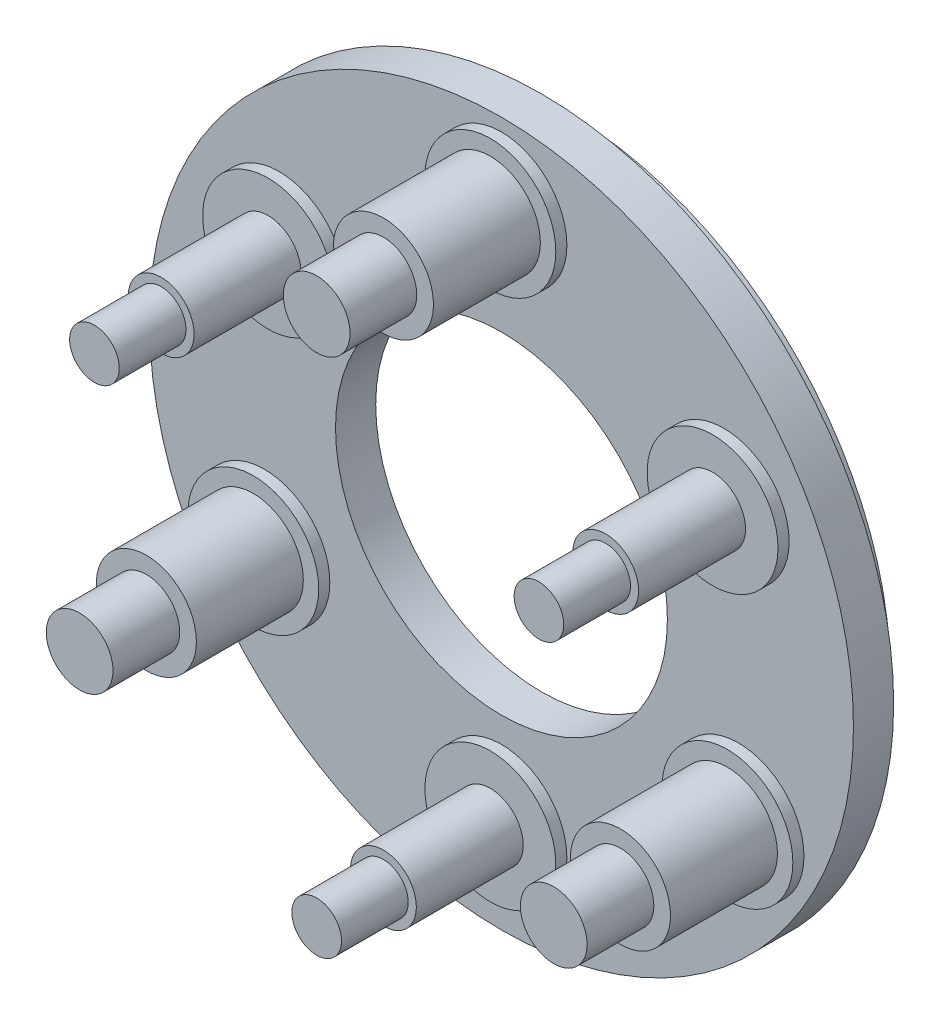
ISO-10303-21;
HEADER;
FILE_DESCRIPTION(('STEP AP214'),'2;1');
FILE_NAME('part.step','',(''),(''),'','','');
FILE_SCHEMA(('AUTOMOTIVE_DESIGN { 1 0 10303 214 1 1 1 1 }'));
ENDSEC;
DATA;
#1=APPLICATION_CONTEXT('core data for automotive mechanical design processes');
#2=APPLICATION_PROTOCOL_DEFINITION('international standard','automotive_design',2000,#1);
#3=PRODUCT_CONTEXT('',#1,'mechanical');
#4=PRODUCT('Part','Part','',(#3));
#5=PRODUCT_RELATED_PRODUCT_CATEGORY('part','',(#4));
#6=PRODUCT_DEFINITION_FORMATION('','',#4);
#7=PRODUCT_DEFINITION_CONTEXT('part definition',#1,'design');
#8=PRODUCT_DEFINITION('design','',#6,#7);
#9=PRODUCT_DEFINITION_SHAPE('','',#8);
#10=(LENGTH_UNIT() NAMED_UNIT(*) SI_UNIT(.MILLI.,.METRE.));
#11=(NAMED_UNIT(*) PLANE_ANGLE_UNIT() SI_UNIT($,.RADIAN.));
#12=(NAMED_UNIT(*) SI_UNIT($,.STERADIAN.) SOLID_ANGLE_UNIT());
#13=UNCERTAINTY_MEASURE_WITH_UNIT(LENGTH_MEASURE(1.E-05),#10,'distance_accuracy_value','');
#14=(GEOMETRIC_REPRESENTATION_CONTEXT(3) GLOBAL_UNCERTAINTY_ASSIGNED_CONTEXT((#13)) GLOBAL_UNIT_ASSIGNED_CONTEXT((#10,
#11,#12)) REPRESENTATION_CONTEXT('',''));
#15=CARTESIAN_POINT('',(0.,0.,0.));
#16=DIRECTION('',(0.,0.,1.));
#17=DIRECTION('',(1.,0.,0.));
#18=AXIS2_PLACEMENT_3D('',#15,#16,#17);
#19=CARTESIAN_POINT('',(0.,0.,0.));
#20=DIRECTION('',(0.,0.,1.));
#21=DIRECTION('',(1.,0.,0.));
#22=AXIS2_PLACEMENT_3D('',#19,#20,#21);
#23=PLANE('',#22);
#24=CARTESIAN_POINT('',(0.,0.,0.));
#25=DIRECTION('',(0.,0.,1.));
#26=DIRECTION('',(1.,0.,0.));
#27=AXIS2_PLACEMENT_3D('',#24,#25,#26);
#28=CIRCLE('',#27,4.9276);
#29=CARTESIAN_POINT('',(4.9276,0.,0.));
#30=VERTEX_POINT('',#29);
#31=EDGE_CURVE('E48',#30,#30,#28,.T.);
#32=ORIENTED_EDGE('',*,*,#31,.T.);
#33=EDGE_LOOP('',(#32));
#34=FACE_BOUND('',#33,.T.);
#35=CARTESIAN_POINT('',(0.,0.,0.));
#36=DIRECTION('',(0.,0.,-1.));
#37=DIRECTION('',(-1.,0.,0.));
#38=AXIS2_PLACEMENT_3D('',#35,#36,#37);
#39=CIRCLE('',#38,8.89);
#40=CARTESIAN_POINT('',(-8.89,0.,0.));
#41=VERTEX_POINT('',#40);
#42=EDGE_CURVE('E57',#41,#41,#39,.T.);
#43=ORIENTED_EDGE('',*,*,#42,.T.);
#44=EDGE_LOOP('',(#43));
#45=FACE_BOUND('',#44,.T.);
#46=ADVANCED_FACE('F30',(#34,#45),#23,.F.);
#47=CARTESIAN_POINT('',(0.,0.,1.1938));
#48=DIRECTION('',(0.,0.,1.));
#49=DIRECTION('',(1.,0.,0.));
#50=AXIS2_PLACEMENT_3D('',#47,#48,#49);
#51=PLANE('',#50);
#52=CARTESIAN_POINT('',(-6.59911357683746,3.80999999999994,1.1938));
#53=DIRECTION('',(0.,0.,1.));
#54=DIRECTION('',(-0.499999999999992,-0.866025403784443,0.));
#55=AXIS2_PLACEMENT_3D('',#52,#53,#54);
#56=CIRCLE('',#55,1.9431);
#57=CARTESIAN_POINT('',(-7.57066357683744,2.12722603790639,1.1938));
#58=VERTEX_POINT('',#57);
#59=EDGE_CURVE('E117',#58,#58,#56,.T.);
#60=ORIENTED_EDGE('',*,*,#59,.F.);
#61=EDGE_LOOP('',(#60));
#62=FACE_BOUND('',#61,.T.);
#63=CARTESIAN_POINT('',(7.03905448195995,-4.06399999999994,1.1938));
#64=DIRECTION('',(0.,0.,1.));
#65=DIRECTION('',(-0.499999999999992,-0.866025403784443,0.));
#66=AXIS2_PLACEMENT_3D('',#63,#64,#65);
#67=CIRCLE('',#66,1.9431);
#68=CARTESIAN_POINT('',(6.06750448195997,-5.74677396209349,1.1938));
#69=VERTEX_POINT('',#68);
#70=EDGE_CURVE('E111',#69,#69,#67,.T.);
#71=ORIENTED_EDGE('',*,*,#70,.F.);
#72=EDGE_LOOP('',(#71));
#73=FACE_BOUND('',#72,.T.);
#74=CARTESIAN_POINT('',(6.5991135768374,3.81000000000003,1.1938));
#75=DIRECTION('',(0.,0.,1.));
#76=DIRECTION('',(-0.500000000000004,0.866025403784436,0.));
#77=AXIS2_PLACEMENT_3D('',#74,#75,#76);
#78=CIRCLE('',#77,1.9431);
#79=CARTESIAN_POINT('',(5.6275635768374,5.49277396209357,1.1938));
#80=VERTEX_POINT('',#79);
#81=EDGE_CURVE('E105',#80,#80,#78,.T.);
#82=ORIENTED_EDGE('',*,*,#81,.F.);
#83=EDGE_LOOP('',(#82));
#84=FACE_BOUND('',#83,.T.);
#85=CARTESIAN_POINT('',(-7.0390544819599,-4.06400000000003,1.1938));
#86=DIRECTION('',(0.,0.,1.));
#87=DIRECTION('',(-0.500000000000004,0.866025403784436,0.));
#88=AXIS2_PLACEMENT_3D('',#85,#86,#87);
#89=CIRCLE('',#88,1.9431);
#90=CARTESIAN_POINT('',(-8.01060448195991,-2.38122603790649,1.1938));
#91=VERTEX_POINT('',#90);
#92=EDGE_CURVE('E99',#91,#91,#89,.T.);
#93=ORIENTED_EDGE('',*,*,#92,.F.);
#94=EDGE_LOOP('',(#93));
#95=FACE_BOUND('',#94,.T.);
#96=CARTESIAN_POINT('',(0.,-7.62,1.1938));
#97=DIRECTION('',(0.,0.,1.));
#98=DIRECTION('',(1.,0.,0.));
#99=AXIS2_PLACEMENT_3D('',#96,#97,#98);
#100=CIRCLE('',#99,1.9431);
#101=CARTESIAN_POINT('',(1.9431,-7.62,1.1938));
#102=VERTEX_POINT('',#101);
#103=EDGE_CURVE('E69',#102,#102,#100,.T.);
#104=ORIENTED_EDGE('',*,*,#103,.F.);
#105=EDGE_LOOP('',(#104));
#106=FACE_BOUND('',#105,.T.);
#107=CARTESIAN_POINT('',(0.,8.128,1.1938));
#108=DIRECTION('',(0.,0.,1.));
#109=DIRECTION('',(1.,0.,0.));
#110=AXIS2_PLACEMENT_3D('',#107,#108,#109);
#111=CIRCLE('',#110,1.9431);
#112=CARTESIAN_POINT('',(1.9431,8.128,1.1938));
#113=VERTEX_POINT('',#112);
#114=EDGE_CURVE('E63',#113,#113,#111,.T.);
#115=ORIENTED_EDGE('',*,*,#114,.F.);
#116=EDGE_LOOP('',(#115));
#117=FACE_BOUND('',#116,.T.);
#118=CARTESIAN_POINT('',(0.,0.,1.1938));
#119=DIRECTION('',(0.,0.,1.));
#120=DIRECTION('',(1.,0.,0.));
#121=AXIS2_PLACEMENT_3D('',#118,#119,#120);
#122=CIRCLE('',#121,10.4521);
#123=CARTESIAN_POINT('',(10.4521,0.,1.1938));
#124=VERTEX_POINT('',#123);
#125=EDGE_CURVE('E37',#124,#124,#122,.T.);
#126=ORIENTED_EDGE('',*,*,#125,.T.);
#127=EDGE_LOOP('',(#126));
#128=FACE_BOUND('',#127,.T.);
#129=CARTESIAN_POINT('',(0.,0.,1.1938));
#130=DIRECTION('',(0.,0.,1.));
#131=DIRECTION('',(1.,0.,0.));
#132=AXIS2_PLACEMENT_3D('',#129,#130,#131);
#133=CIRCLE('',#132,4.9276);
#134=CARTESIAN_POINT('',(4.9276,0.,1.1938));
#135=VERTEX_POINT('',#134);
#136=EDGE_CURVE('E46',#135,#135,#133,.T.);
#137=ORIENTED_EDGE('',*,*,#136,.F.);
#138=EDGE_LOOP('',(#137));
#139=FACE_BOUND('',#138,.T.);
#140=ADVANCED_FACE('F208',(#62,#73,#84,#95,#106,#117,#128,#139),#51,.T.);
#141=CARTESIAN_POINT('',(0.,0.,0.));
#142=DIRECTION('',(0.,0.,1.));
#143=DIRECTION('',(1.,0.,0.));
#144=AXIS2_PLACEMENT_3D('',#141,#142,#143);
#145=CIRCLE('',#144,9.6393);
#146=CARTESIAN_POINT('',(9.6393,0.,0.));
#147=VERTEX_POINT('',#146);
#148=EDGE_CURVE('E10',#147,#147,#145,.F.);
#149=ORIENTED_EDGE('',*,*,#148,.F.);
#150=EDGE_LOOP('',(#149));
#151=FACE_BOUND('',#150,.T.);
#152=CARTESIAN_POINT('',(0.,0.,0.));
#153=DIRECTION('',(0.,0.,1.));
#154=DIRECTION('',(1.,0.,0.));
#155=AXIS2_PLACEMENT_3D('',#152,#153,#154);
#156=CIRCLE('',#155,10.4521);
#157=CARTESIAN_POINT('',(10.4521,0.,0.));
#158=VERTEX_POINT('',#157);
#159=EDGE_CURVE('E41',#158,#158,#156,.T.);
#160=ORIENTED_EDGE('',*,*,#159,.F.);
#161=EDGE_LOOP('',(#160));
#162=FACE_BOUND('',#161,.T.);
#163=ADVANCED_FACE('F211',(#151,#162),#23,.F.);
#164=CARTESIAN_POINT('',(0.,0.,1.1938));
#165=DIRECTION('',(0.,0.,-1.));
#166=DIRECTION('',(-1.,0.,0.));
#167=AXIS2_PLACEMENT_3D('',#164,#165,#166);
#168=CYLINDRICAL_SURFACE('',#167,10.4521);
#169=ORIENTED_EDGE('',*,*,#125,.F.);
#170=EDGE_LOOP('',(#169));
#171=FACE_BOUND('',#170,.T.);
#172=ORIENTED_EDGE('',*,*,#159,.T.);
#173=EDGE_LOOP('',(#172));
#174=FACE_BOUND('',#173,.T.);
#175=ADVANCED_FACE('F32',(#171,#174),#168,.T.);
#176=CARTESIAN_POINT('',(0.,0.,1.1938));
#177=DIRECTION('',(0.,0.,-1.));
#178=DIRECTION('',(-1.,0.,0.));
#179=AXIS2_PLACEMENT_3D('',#176,#177,#178);
#180=CYLINDRICAL_SURFACE('',#179,4.9276);
#181=ORIENTED_EDGE('',*,*,#136,.T.);
#182=EDGE_LOOP('',(#181));
#183=FACE_BOUND('',#182,.T.);
#184=ORIENTED_EDGE('',*,*,#31,.F.);
#185=EDGE_LOOP('',(#184));
#186=FACE_BOUND('',#185,.T.);
#187=ADVANCED_FACE('F225',(#183,#186),#180,.F.);
#188=CARTESIAN_POINT('',(0.,0.,-0.7112));
#189=DIRECTION('',(0.,0.,-1.));
#190=DIRECTION('',(-1.,0.,0.));
#191=AXIS2_PLACEMENT_3D('',#188,#189,#190);
#192=PLANE('',#191);
#193=CARTESIAN_POINT('',(0.,0.,-0.7112));
#194=DIRECTION('',(0.,0.,-1.));
#195=DIRECTION('',(-1.,0.,0.));
#196=AXIS2_PLACEMENT_3D('',#193,#194,#195);
#197=CIRCLE('',#196,9.6393);
#198=CARTESIAN_POINT('',(-9.6393,0.,-0.7112));
#199=VERTEX_POINT('',#198);
#200=EDGE_CURVE('E51',#199,#199,#197,.T.);
#201=ORIENTED_EDGE('',*,*,#200,.T.);
#202=EDGE_LOOP('',(#201));
#203=FACE_BOUND('',#202,.T.);
#204=CARTESIAN_POINT('',(0.,0.,-0.7112));
#205=DIRECTION('',(0.,0.,-1.));
#206=DIRECTION('',(-1.,0.,0.));
#207=AXIS2_PLACEMENT_3D('',#204,#205,#206);
#208=CIRCLE('',#207,8.89);
#209=CARTESIAN_POINT('',(-8.89,0.,-0.7112));
#210=VERTEX_POINT('',#209);
#211=EDGE_CURVE('E56',#210,#210,#208,.T.);
#212=ORIENTED_EDGE('',*,*,#211,.F.);
#213=EDGE_LOOP('',(#212));
#214=FACE_BOUND('',#213,.T.);
#215=ADVANCED_FACE('F228',(#203,#214),#192,.T.);
#216=CARTESIAN_POINT('',(0.,0.,-0.7112));
#217=DIRECTION('',(0.,0.,1.));
#218=DIRECTION('',(1.,0.,0.));
#219=AXIS2_PLACEMENT_3D('',#216,#217,#218);
#220=CYLINDRICAL_SURFACE('',#219,9.6393);
#221=ORIENTED_EDGE('',*,*,#200,.F.);
#222=EDGE_LOOP('',(#221));
#223=FACE_BOUND('',#222,.T.);
#224=ORIENTED_EDGE('',*,*,#148,.T.);
#225=EDGE_LOOP('',(#224));
#226=FACE_BOUND('',#225,.T.);
#227=ADVANCED_FACE('F239',(#223,#226),#220,.T.);
#228=CARTESIAN_POINT('',(0.,0.,-0.7112));
#229=DIRECTION('',(0.,0.,1.));
#230=DIRECTION('',(1.,0.,0.));
#231=AXIS2_PLACEMENT_3D('',#228,#229,#230);
#232=CYLINDRICAL_SURFACE('',#231,8.89);
#233=ORIENTED_EDGE('',*,*,#211,.T.);
#234=EDGE_LOOP('',(#233));
#235=FACE_BOUND('',#234,.T.);
#236=ORIENTED_EDGE('',*,*,#42,.F.);
#237=EDGE_LOOP('',(#236));
#238=FACE_BOUND('',#237,.T.);
#239=ADVANCED_FACE('F236',(#235,#238),#232,.F.);
#240=CARTESIAN_POINT('',(0.,8.128,1.524));
#241=DIRECTION('',(0.,0.,-1.));
#242=DIRECTION('',(-1.,0.,0.));
#243=AXIS2_PLACEMENT_3D('',#240,#241,#242);
#244=CYLINDRICAL_SURFACE('',#243,1.9431);
#245=CARTESIAN_POINT('',(0.,8.128,1.524));
#246=DIRECTION('',(0.,0.,1.));
#247=DIRECTION('',(1.,0.,0.));
#248=AXIS2_PLACEMENT_3D('',#245,#246,#247);
#249=CIRCLE('',#248,1.9431);
#250=CARTESIAN_POINT('',(1.9431,8.128,1.524));
#251=VERTEX_POINT('',#250);
#252=EDGE_CURVE('E60',#251,#251,#249,.T.);
#253=ORIENTED_EDGE('',*,*,#252,.F.);
#254=EDGE_LOOP('',(#253));
#255=FACE_BOUND('',#254,.T.);
#256=ORIENTED_EDGE('',*,*,#114,.T.);
#257=EDGE_LOOP('',(#256));
#258=FACE_BOUND('',#257,.T.);
#259=ADVANCED_FACE('F238',(#255,#258),#244,.T.);
#260=CARTESIAN_POINT('',(0.,8.128,1.524));
#261=DIRECTION('',(0.,0.,1.));
#262=DIRECTION('',(1.,0.,0.));
#263=AXIS2_PLACEMENT_3D('',#260,#261,#262);
#264=PLANE('',#263);
#265=CARTESIAN_POINT('',(0.,8.128,1.524));
#266=DIRECTION('',(0.,0.,1.));
#267=DIRECTION('',(1.,0.,0.));
#268=AXIS2_PLACEMENT_3D('',#265,#266,#267);
#269=CIRCLE('',#268,1.4859);
#270=CARTESIAN_POINT('',(1.4859,8.128,1.524));
#271=VERTEX_POINT('',#270);
#272=EDGE_CURVE('E75',#271,#271,#269,.T.);
#273=ORIENTED_EDGE('',*,*,#272,.F.);
#274=EDGE_LOOP('',(#273));
#275=FACE_BOUND('',#274,.T.);
#276=ORIENTED_EDGE('',*,*,#252,.T.);
#277=EDGE_LOOP('',(#276));
#278=FACE_BOUND('',#277,.T.);
#279=ADVANCED_FACE('F246',(#275,#278),#264,.T.);
#280=CARTESIAN_POINT('',(0.,-7.62,1.524));
#281=DIRECTION('',(0.,0.,-1.));
#282=DIRECTION('',(-1.,0.,0.));
#283=AXIS2_PLACEMENT_3D('',#280,#281,#282);
#284=CYLINDRICAL_SURFACE('',#283,1.9431);
#285=CARTESIAN_POINT('',(0.,-7.62,1.524));
#286=DIRECTION('',(0.,0.,1.));
#287=DIRECTION('',(1.,0.,0.));
#288=AXIS2_PLACEMENT_3D('',#285,#286,#287);
#289=CIRCLE('',#288,1.9431);
#290=CARTESIAN_POINT('',(1.9431,-7.62,1.524));
#291=VERTEX_POINT('',#290);
#292=EDGE_CURVE('E66',#291,#291,#289,.T.);
#293=ORIENTED_EDGE('',*,*,#292,.F.);
#294=EDGE_LOOP('',(#293));
#295=FACE_BOUND('',#294,.T.);
#296=ORIENTED_EDGE('',*,*,#103,.T.);
#297=EDGE_LOOP('',(#296));
#298=FACE_BOUND('',#297,.T.);
#299=ADVANCED_FACE('F296',(#295,#298),#284,.T.);
#300=CARTESIAN_POINT('',(0.,-7.62,1.524));
#301=DIRECTION('',(0.,0.,1.));
#302=DIRECTION('',(1.,0.,0.));
#303=AXIS2_PLACEMENT_3D('',#300,#301,#302);
#304=PLANE('',#303);
#305=CARTESIAN_POINT('',(0.,-7.62,1.524));
#306=DIRECTION('',(0.,0.,1.));
#307=DIRECTION('',(1.,0.,0.));
#308=AXIS2_PLACEMENT_3D('',#305,#306,#307);
#309=CIRCLE('',#308,0.9779);
#310=CARTESIAN_POINT('',(0.977900000000002,-7.62,1.524));
#311=VERTEX_POINT('',#310);
#312=EDGE_CURVE('E81',#311,#311,#309,.T.);
#313=ORIENTED_EDGE('',*,*,#312,.F.);
#314=EDGE_LOOP('',(#313));
#315=FACE_BOUND('',#314,.T.);
#316=ORIENTED_EDGE('',*,*,#292,.T.);
#317=EDGE_LOOP('',(#316));
#318=FACE_BOUND('',#317,.T.);
#319=ADVANCED_FACE('F301',(#315,#318),#304,.T.);
#320=CARTESIAN_POINT('',(0.,8.128,4.699));
#321=DIRECTION('',(0.,0.,-1.));
#322=DIRECTION('',(-1.,0.,0.));
#323=AXIS2_PLACEMENT_3D('',#320,#321,#322);
#324=CYLINDRICAL_SURFACE('',#323,1.4859);
#325=CARTESIAN_POINT('',(0.,8.128,4.699));
#326=DIRECTION('',(0.,0.,1.));
#327=DIRECTION('',(1.,0.,0.));
#328=AXIS2_PLACEMENT_3D('',#325,#326,#327);
#329=CIRCLE('',#328,1.4859);
#330=CARTESIAN_POINT('',(1.4859,8.128,4.699));
#331=VERTEX_POINT('',#330);
#332=EDGE_CURVE('E72',#331,#331,#329,.T.);
#333=ORIENTED_EDGE('',*,*,#332,.F.);
#334=EDGE_LOOP('',(#333));
#335=FACE_BOUND('',#334,.T.);
#336=ORIENTED_EDGE('',*,*,#272,.T.);
#337=EDGE_LOOP('',(#336));
#338=FACE_BOUND('',#337,.T.);
#339=ADVANCED_FACE('F317',(#335,#338),#324,.T.);
#340=CARTESIAN_POINT('',(0.,8.128,4.699));
#341=DIRECTION('',(0.,0.,1.));
#342=DIRECTION('',(1.,0.,0.));
#343=AXIS2_PLACEMENT_3D('',#340,#341,#342);
#344=PLANE('',#343);
#345=CARTESIAN_POINT('',(0.,8.128,4.699));
#346=DIRECTION('',(0.,0.,1.));
#347=DIRECTION('',(1.,0.,0.));
#348=AXIS2_PLACEMENT_3D('',#345,#346,#347);
#349=CIRCLE('',#348,0.9906);
#350=CARTESIAN_POINT('',(0.9906,8.128,4.699));
#351=VERTEX_POINT('',#350);
#352=EDGE_CURVE('E87',#351,#351,#349,.T.);
#353=ORIENTED_EDGE('',*,*,#352,.F.);
#354=EDGE_LOOP('',(#353));
#355=FACE_BOUND('',#354,.T.);
#356=ORIENTED_EDGE('',*,*,#332,.T.);
#357=EDGE_LOOP('',(#356));
#358=FACE_BOUND('',#357,.T.);
#359=ADVANCED_FACE('F327',(#355,#358),#344,.T.);
#360=CARTESIAN_POINT('',(0.,-7.62,4.699));
#361=DIRECTION('',(0.,0.,-1.));
#362=DIRECTION('',(-1.,0.,0.));
#363=AXIS2_PLACEMENT_3D('',#360,#361,#362);
#364=CYLINDRICAL_SURFACE('',#363,0.9779);
#365=CARTESIAN_POINT('',(0.,-7.62,4.699));
#366=DIRECTION('',(0.,0.,1.));
#367=DIRECTION('',(1.,0.,0.));
#368=AXIS2_PLACEMENT_3D('',#365,#366,#367);
#369=CIRCLE('',#368,0.9779);
#370=CARTESIAN_POINT('',(0.977900000000002,-7.62,4.699));
#371=VERTEX_POINT('',#370);
#372=EDGE_CURVE('E78',#371,#371,#369,.T.);
#373=ORIENTED_EDGE('',*,*,#372,.F.);
#374=EDGE_LOOP('',(#373));
#375=FACE_BOUND('',#374,.T.);
#376=ORIENTED_EDGE('',*,*,#312,.T.);
#377=EDGE_LOOP('',(#376));
#378=FACE_BOUND('',#377,.T.);
#379=ADVANCED_FACE('F335',(#375,#378),#364,.T.);
#380=CARTESIAN_POINT('',(0.,-7.62,4.699));
#381=DIRECTION('',(0.,0.,1.));
#382=DIRECTION('',(1.,0.,0.));
#383=AXIS2_PLACEMENT_3D('',#380,#381,#382);
#384=PLANE('',#383);
#385=CARTESIAN_POINT('',(0.,-7.62,4.699));
#386=DIRECTION('',(0.,0.,1.));
#387=DIRECTION('',(1.,0.,0.));
#388=AXIS2_PLACEMENT_3D('',#385,#386,#387);
#389=CIRCLE('',#388,0.7366);
#390=CARTESIAN_POINT('',(0.736600000000002,-7.62,4.699));
#391=VERTEX_POINT('',#390);
#392=EDGE_CURVE('E93',#391,#391,#389,.T.);
#393=ORIENTED_EDGE('',*,*,#392,.F.);
#394=EDGE_LOOP('',(#393));
#395=FACE_BOUND('',#394,.T.);
#396=ORIENTED_EDGE('',*,*,#372,.T.);
#397=EDGE_LOOP('',(#396));
#398=FACE_BOUND('',#397,.T.);
#399=ADVANCED_FACE('F340',(#395,#398),#384,.T.);
#400=CARTESIAN_POINT('',(0.,8.128,6.6802));
#401=DIRECTION('',(0.,0.,-1.));
#402=DIRECTION('',(-1.,0.,0.));
#403=AXIS2_PLACEMENT_3D('',#400,#401,#402);
#404=CYLINDRICAL_SURFACE('',#403,0.9906);
#405=CARTESIAN_POINT('',(0.,8.128,6.6802));
#406=DIRECTION('',(0.,0.,1.));
#407=DIRECTION('',(1.,0.,0.));
#408=AXIS2_PLACEMENT_3D('',#405,#406,#407);
#409=CIRCLE('',#408,0.9906);
#410=CARTESIAN_POINT('',(0.9906,8.128,6.6802));
#411=VERTEX_POINT('',#410);
#412=EDGE_CURVE('E84',#411,#411,#409,.T.);
#413=ORIENTED_EDGE('',*,*,#412,.F.);
#414=EDGE_LOOP('',(#413));
#415=FACE_BOUND('',#414,.T.);
#416=ORIENTED_EDGE('',*,*,#352,.T.);
#417=EDGE_LOOP('',(#416));
#418=FACE_BOUND('',#417,.T.);
#419=ADVANCED_FACE('F357',(#415,#418),#404,.T.);
#420=CARTESIAN_POINT('',(0.,8.128,6.6802));
#421=DIRECTION('',(0.,0.,1.));
#422=DIRECTION('',(1.,0.,0.));
#423=AXIS2_PLACEMENT_3D('',#420,#421,#422);
#424=PLANE('',#423);
#425=ORIENTED_EDGE('',*,*,#412,.T.);
#426=EDGE_LOOP('',(#425));
#427=FACE_BOUND('',#426,.T.);
#428=ADVANCED_FACE('F367',(#427),#424,.T.);
#429=CARTESIAN_POINT('',(0.,-7.62,6.6802));
#430=DIRECTION('',(0.,0.,-1.));
#431=DIRECTION('',(-1.,0.,0.));
#432=AXIS2_PLACEMENT_3D('',#429,#430,#431);
#433=CYLINDRICAL_SURFACE('',#432,0.7366);
#434=CARTESIAN_POINT('',(0.,-7.62,6.6802));
#435=DIRECTION('',(0.,0.,1.));
#436=DIRECTION('',(1.,0.,0.));
#437=AXIS2_PLACEMENT_3D('',#434,#435,#436);
#438=CIRCLE('',#437,0.7366);
#439=CARTESIAN_POINT('',(0.736600000000002,-7.62,6.6802));
#440=VERTEX_POINT('',#439);
#441=EDGE_CURVE('E90',#440,#440,#438,.T.);
#442=ORIENTED_EDGE('',*,*,#441,.F.);
#443=EDGE_LOOP('',(#442));
#444=FACE_BOUND('',#443,.T.);
#445=ORIENTED_EDGE('',*,*,#392,.T.);
#446=EDGE_LOOP('',(#445));
#447=FACE_BOUND('',#446,.T.);
#448=ADVANCED_FACE('F377',(#444,#447),#433,.T.);
#449=CARTESIAN_POINT('',(0.,-7.62,6.6802));
#450=DIRECTION('',(0.,0.,1.));
#451=DIRECTION('',(1.,0.,0.));
#452=AXIS2_PLACEMENT_3D('',#449,#450,#451);
#453=PLANE('',#452);
#454=ORIENTED_EDGE('',*,*,#441,.T.);
#455=EDGE_LOOP('',(#454));
#456=FACE_BOUND('',#455,.T.);
#457=ADVANCED_FACE('F387',(#456),#453,.T.);
#458=CARTESIAN_POINT('',(-7.0390544819599,-4.06400000000003,1.524));
#459=DIRECTION('',(0.,0.,-1.));
#460=DIRECTION('',(-1.,0.,0.));
#461=AXIS2_PLACEMENT_3D('',#458,#459,#460);
#462=CYLINDRICAL_SURFACE('',#461,1.9431);
#463=CARTESIAN_POINT('',(-7.0390544819599,-4.06400000000003,1.524));
#464=DIRECTION('',(0.,0.,1.));
#465=DIRECTION('',(-0.500000000000004,0.866025403784436,0.));
#466=AXIS2_PLACEMENT_3D('',#463,#464,#465);
#467=CIRCLE('',#466,1.9431);
#468=CARTESIAN_POINT('',(-8.01060448195991,-2.38122603790649,1.524));
#469=VERTEX_POINT('',#468);
#470=EDGE_CURVE('E96',#469,#469,#467,.T.);
#471=ORIENTED_EDGE('',*,*,#470,.F.);
#472=EDGE_LOOP('',(#471));
#473=FACE_BOUND('',#472,.T.);
#474=ORIENTED_EDGE('',*,*,#92,.T.);
#475=EDGE_LOOP('',(#474));
#476=FACE_BOUND('',#475,.T.);
#477=ADVANCED_FACE('F397',(#473,#476),#462,.T.);
#478=CARTESIAN_POINT('',(-7.0390544819599,-4.06400000000003,1.524));
#479=DIRECTION('',(0.,0.,1.));
#480=DIRECTION('',(-0.500000000000004,0.866025403784436,0.));
#481=AXIS2_PLACEMENT_3D('',#478,#479,#480);
#482=PLANE('',#481);
#483=CARTESIAN_POINT('',(-7.0390544819599,-4.06400000000003,1.524));
#484=DIRECTION('',(0.,0.,1.));
#485=DIRECTION('',(-0.500000000000004,0.866025403784436,0.));
#486=AXIS2_PLACEMENT_3D('',#483,#484,#485);
#487=CIRCLE('',#486,1.4859);
#488=CARTESIAN_POINT('',(-7.78200448195991,-2.77717285251674,1.524));
#489=VERTEX_POINT('',#488);
#490=EDGE_CURVE('E123',#489,#489,#487,.T.);
#491=ORIENTED_EDGE('',*,*,#490,.F.);
#492=EDGE_LOOP('',(#491));
#493=FACE_BOUND('',#492,.T.);
#494=ORIENTED_EDGE('',*,*,#470,.T.);
#495=EDGE_LOOP('',(#494));
#496=FACE_BOUND('',#495,.T.);
#497=ADVANCED_FACE('F414',(#493,#496),#482,.T.);
#498=CARTESIAN_POINT('',(6.5991135768374,3.81000000000003,1.524));
#499=DIRECTION('',(0.,0.,-1.));
#500=DIRECTION('',(-1.,0.,0.));
#501=AXIS2_PLACEMENT_3D('',#498,#499,#500);
#502=CYLINDRICAL_SURFACE('',#501,1.9431);
#503=CARTESIAN_POINT('',(6.5991135768374,3.81000000000003,1.524));
#504=DIRECTION('',(0.,0.,1.));
#505=DIRECTION('',(-0.500000000000004,0.866025403784436,0.));
#506=AXIS2_PLACEMENT_3D('',#503,#504,#505);
#507=CIRCLE('',#506,1.9431);
#508=CARTESIAN_POINT('',(5.6275635768374,5.49277396209357,1.524));
#509=VERTEX_POINT('',#508);
#510=EDGE_CURVE('E102',#509,#509,#507,.T.);
#511=ORIENTED_EDGE('',*,*,#510,.F.);
#512=EDGE_LOOP('',(#511));
#513=FACE_BOUND('',#512,.T.);
#514=ORIENTED_EDGE('',*,*,#81,.T.);
#515=EDGE_LOOP('',(#514));
#516=FACE_BOUND('',#515,.T.);
#517=ADVANCED_FACE('F424',(#513,#516),#502,.T.);
#518=CARTESIAN_POINT('',(6.5991135768374,3.81000000000003,1.524));
#519=DIRECTION('',(0.,0.,1.));
#520=DIRECTION('',(-0.500000000000004,0.866025403784436,0.));
#521=AXIS2_PLACEMENT_3D('',#518,#519,#520);
#522=PLANE('',#521);
#523=CARTESIAN_POINT('',(6.5991135768374,3.81000000000003,1.524));
#524=DIRECTION('',(0.,0.,1.));
#525=DIRECTION('',(-0.500000000000004,0.866025403784436,0.));
#526=AXIS2_PLACEMENT_3D('',#523,#524,#525);
#527=CIRCLE('',#526,0.9779);
#528=CARTESIAN_POINT('',(6.1101635768374,4.65688624236083,1.524));
#529=VERTEX_POINT('',#528);
#530=EDGE_CURVE('E129',#529,#529,#527,.T.);
#531=ORIENTED_EDGE('',*,*,#530,.F.);
#532=EDGE_LOOP('',(#531));
#533=FACE_BOUND('',#532,.T.);
#534=ORIENTED_EDGE('',*,*,#510,.T.);
#535=EDGE_LOOP('',(#534));
#536=FACE_BOUND('',#535,.T.);
#537=ADVANCED_FACE('F434',(#533,#536),#522,.T.);
#538=CARTESIAN_POINT('',(7.03905448195995,-4.06399999999994,1.524));
#539=DIRECTION('',(0.,0.,-1.));
#540=DIRECTION('',(-1.,0.,0.));
#541=AXIS2_PLACEMENT_3D('',#538,#539,#540);
#542=CYLINDRICAL_SURFACE('',#541,1.9431);
#543=CARTESIAN_POINT('',(7.03905448195995,-4.06399999999994,1.524));
#544=DIRECTION('',(0.,0.,1.));
#545=DIRECTION('',(-0.499999999999992,-0.866025403784443,0.));
#546=AXIS2_PLACEMENT_3D('',#543,#544,#545);
#547=CIRCLE('',#546,1.9431);
#548=CARTESIAN_POINT('',(6.06750448195997,-5.74677396209349,1.524));
#549=VERTEX_POINT('',#548);
#550=EDGE_CURVE('E108',#549,#549,#547,.T.);
#551=ORIENTED_EDGE('',*,*,#550,.F.);
#552=EDGE_LOOP('',(#551));
#553=FACE_BOUND('',#552,.T.);
#554=ORIENTED_EDGE('',*,*,#70,.T.);
#555=EDGE_LOOP('',(#554));
#556=FACE_BOUND('',#555,.T.);
#557=ADVANCED_FACE('F444',(#553,#556),#542,.T.);
#558=CARTESIAN_POINT('',(7.03905448195995,-4.06399999999994,1.524));
#559=DIRECTION('',(0.,0.,1.));
#560=DIRECTION('',(-0.499999999999992,-0.866025403784443,0.));
#561=AXIS2_PLACEMENT_3D('',#558,#559,#560);
#562=PLANE('',#561);
#563=CARTESIAN_POINT('',(7.03905448195995,-4.06399999999994,1.524));
#564=DIRECTION('',(0.,0.,1.));
#565=DIRECTION('',(-0.499999999999992,-0.866025403784443,0.));
#566=AXIS2_PLACEMENT_3D('',#563,#564,#565);
#567=CIRCLE('',#566,1.4859);
#568=CARTESIAN_POINT('',(6.29610448195997,-5.35082714748324,1.524));
#569=VERTEX_POINT('',#568);
#570=EDGE_CURVE('E135',#569,#569,#567,.T.);
#571=ORIENTED_EDGE('',*,*,#570,.F.);
#572=EDGE_LOOP('',(#571));
#573=FACE_BOUND('',#572,.T.);
#574=ORIENTED_EDGE('',*,*,#550,.T.);
#575=EDGE_LOOP('',(#574));
#576=FACE_BOUND('',#575,.T.);
#577=ADVANCED_FACE('F204',(#573,#576),#562,.T.);
#578=CARTESIAN_POINT('',(-6.59911357683746,3.80999999999994,1.524));
#579=DIRECTION('',(0.,0.,-1.));
#580=DIRECTION('',(-1.,0.,0.));
#581=AXIS2_PLACEMENT_3D('',#578,#579,#580);
#582=CYLINDRICAL_SURFACE('',#581,1.9431);
#583=CARTESIAN_POINT('',(-6.59911357683746,3.80999999999994,1.524));
#584=DIRECTION('',(0.,0.,1.));
#585=DIRECTION('',(-0.499999999999992,-0.866025403784443,0.));
#586=AXIS2_PLACEMENT_3D('',#583,#584,#585);
#587=CIRCLE('',#586,1.9431);
#588=CARTESIAN_POINT('',(-7.57066357683744,2.12722603790639,1.524));
#589=VERTEX_POINT('',#588);
#590=EDGE_CURVE('E114',#589,#589,#587,.T.);
#591=ORIENTED_EDGE('',*,*,#590,.F.);
#592=EDGE_LOOP('',(#591));
#593=FACE_BOUND('',#592,.T.);
#594=ORIENTED_EDGE('',*,*,#59,.T.);
#595=EDGE_LOOP('',(#594));
#596=FACE_BOUND('',#595,.T.);
#597=ADVANCED_FACE('F198',(#593,#596),#582,.T.);
#598=CARTESIAN_POINT('',(-6.59911357683746,3.80999999999994,1.524));
#599=DIRECTION('',(0.,0.,1.));
#600=DIRECTION('',(-0.499999999999992,-0.866025403784443,0.));
#601=AXIS2_PLACEMENT_3D('',#598,#599,#600);
#602=PLANE('',#601);
#603=CARTESIAN_POINT('',(-6.59911357683746,3.80999999999994,1.524));
#604=DIRECTION('',(0.,0.,1.));
#605=DIRECTION('',(-0.499999999999992,-0.866025403784443,0.));
#606=AXIS2_PLACEMENT_3D('',#603,#604,#605);
#607=CIRCLE('',#606,0.9779);
#608=CARTESIAN_POINT('',(-7.08806357683745,2.96311375763913,1.524));
#609=VERTEX_POINT('',#608);
#610=EDGE_CURVE('E141',#609,#609,#607,.T.);
#611=ORIENTED_EDGE('',*,*,#610,.F.);
#612=EDGE_LOOP('',(#611));
#613=FACE_BOUND('',#612,.T.);
#614=ORIENTED_EDGE('',*,*,#590,.T.);
#615=EDGE_LOOP('',(#614));
#616=FACE_BOUND('',#615,.T.);
#617=ADVANCED_FACE('F194',(#613,#616),#602,.T.);
#618=CARTESIAN_POINT('',(-7.0390544819599,-4.06400000000003,4.699));
#619=DIRECTION('',(0.,0.,-1.));
#620=DIRECTION('',(-1.,0.,0.));
#621=AXIS2_PLACEMENT_3D('',#618,#619,#620);
#622=CYLINDRICAL_SURFACE('',#621,1.4859);
#623=CARTESIAN_POINT('',(-7.0390544819599,-4.06400000000003,4.699));
#624=DIRECTION('',(0.,0.,1.));
#625=DIRECTION('',(-0.500000000000004,0.866025403784436,0.));
#626=AXIS2_PLACEMENT_3D('',#623,#624,#625);
#627=CIRCLE('',#626,1.4859);
#628=CARTESIAN_POINT('',(-7.78200448195991,-2.77717285251674,4.699));
#629=VERTEX_POINT('',#628);
#630=EDGE_CURVE('E120',#629,#629,#627,.T.);
#631=ORIENTED_EDGE('',*,*,#630,.F.);
#632=EDGE_LOOP('',(#631));
#633=FACE_BOUND('',#632,.T.);
#634=ORIENTED_EDGE('',*,*,#490,.T.);
#635=EDGE_LOOP('',(#634));
#636=FACE_BOUND('',#635,.T.);
#637=ADVANCED_FACE('F197',(#633,#636),#622,.T.);
#638=CARTESIAN_POINT('',(-7.0390544819599,-4.06400000000003,4.699));
#639=DIRECTION('',(0.,0.,1.));
#640=DIRECTION('',(-0.500000000000004,0.866025403784436,0.));
#641=AXIS2_PLACEMENT_3D('',#638,#639,#640);
#642=PLANE('',#641);
#643=CARTESIAN_POINT('',(-7.0390544819599,-4.06400000000003,4.699));
#644=DIRECTION('',(0.,0.,1.));
#645=DIRECTION('',(-0.500000000000004,0.866025403784436,0.));
#646=AXIS2_PLACEMENT_3D('',#643,#644,#645);
#647=CIRCLE('',#646,0.9906);
#648=CARTESIAN_POINT('',(-7.5343544819599,-3.20611523501117,4.699));
#649=VERTEX_POINT('',#648);
#650=EDGE_CURVE('E147',#649,#649,#647,.T.);
#651=ORIENTED_EDGE('',*,*,#650,.F.);
#652=EDGE_LOOP('',(#651));
#653=FACE_BOUND('',#652,.T.);
#654=ORIENTED_EDGE('',*,*,#630,.T.);
#655=EDGE_LOOP('',(#654));
#656=FACE_BOUND('',#655,.T.);
#657=ADVANCED_FACE('F484',(#653,#656),#642,.T.);
#658=CARTESIAN_POINT('',(6.5991135768374,3.81000000000003,4.699));
#659=DIRECTION('',(0.,0.,-1.));
#660=DIRECTION('',(-1.,0.,0.));
#661=AXIS2_PLACEMENT_3D('',#658,#659,#660);
#662=CYLINDRICAL_SURFACE('',#661,0.9779);
#663=CARTESIAN_POINT('',(6.5991135768374,3.81000000000003,4.699));
#664=DIRECTION('',(0.,0.,1.));
#665=DIRECTION('',(-0.500000000000004,0.866025403784436,0.));
#666=AXIS2_PLACEMENT_3D('',#663,#664,#665);
#667=CIRCLE('',#666,0.9779);
#668=CARTESIAN_POINT('',(6.1101635768374,4.65688624236083,4.699));
#669=VERTEX_POINT('',#668);
#670=EDGE_CURVE('E126',#669,#669,#667,.T.);
#671=ORIENTED_EDGE('',*,*,#670,.F.);
#672=EDGE_LOOP('',(#671));
#673=FACE_BOUND('',#672,.T.);
#674=ORIENTED_EDGE('',*,*,#530,.T.);
#675=EDGE_LOOP('',(#674));
#676=FACE_BOUND('',#675,.T.);
#677=ADVANCED_FACE('F494',(#673,#676),#662,.T.);
#678=CARTESIAN_POINT('',(6.5991135768374,3.81000000000003,4.699));
#679=DIRECTION('',(0.,0.,1.));
#680=DIRECTION('',(-0.500000000000004,0.866025403784436,0.));
#681=AXIS2_PLACEMENT_3D('',#678,#679,#680);
#682=PLANE('',#681);
#683=CARTESIAN_POINT('',(6.5991135768374,3.81000000000003,4.699));
#684=DIRECTION('',(0.,0.,1.));
#685=DIRECTION('',(-0.500000000000004,0.866025403784436,0.));
#686=AXIS2_PLACEMENT_3D('',#683,#684,#685);
#687=CIRCLE('',#686,0.7366);
#688=CARTESIAN_POINT('',(6.2308135768374,4.44791431242765,4.699));
#689=VERTEX_POINT('',#688);
#690=EDGE_CURVE('E153',#689,#689,#687,.T.);
#691=ORIENTED_EDGE('',*,*,#690,.F.);
#692=EDGE_LOOP('',(#691));
#693=FACE_BOUND('',#692,.T.);
#694=ORIENTED_EDGE('',*,*,#670,.T.);
#695=EDGE_LOOP('',(#694));
#696=FACE_BOUND('',#695,.T.);
#697=ADVANCED_FACE('F504',(#693,#696),#682,.T.);
#698=CARTESIAN_POINT('',(7.03905448195995,-4.06399999999994,4.699));
#699=DIRECTION('',(0.,0.,-1.));
#700=DIRECTION('',(-1.,0.,0.));
#701=AXIS2_PLACEMENT_3D('',#698,#699,#700);
#702=CYLINDRICAL_SURFACE('',#701,1.4859);
#703=CARTESIAN_POINT('',(7.03905448195995,-4.06399999999994,4.699));
#704=DIRECTION('',(0.,0.,1.));
#705=DIRECTION('',(-0.499999999999992,-0.866025403784443,0.));
#706=AXIS2_PLACEMENT_3D('',#703,#704,#705);
#707=CIRCLE('',#706,1.4859);
#708=CARTESIAN_POINT('',(6.29610448195997,-5.35082714748324,4.699));
#709=VERTEX_POINT('',#708);
#710=EDGE_CURVE('E132',#709,#709,#707,.T.);
#711=ORIENTED_EDGE('',*,*,#710,.F.);
#712=EDGE_LOOP('',(#711));
#713=FACE_BOUND('',#712,.T.);
#714=ORIENTED_EDGE('',*,*,#570,.T.);
#715=EDGE_LOOP('',(#714));
#716=FACE_BOUND('',#715,.T.);
#717=ADVANCED_FACE('F514',(#713,#716),#702,.T.);
#718=CARTESIAN_POINT('',(7.03905448195995,-4.06399999999994,4.699));
#719=DIRECTION('',(0.,0.,1.));
#720=DIRECTION('',(-0.499999999999992,-0.866025403784443,0.));
#721=AXIS2_PLACEMENT_3D('',#718,#719,#720);
#722=PLANE('',#721);
#723=CARTESIAN_POINT('',(7.03905448195995,-4.06399999999994,4.699));
#724=DIRECTION('',(0.,0.,1.));
#725=DIRECTION('',(-0.499999999999992,-0.866025403784443,0.));
#726=AXIS2_PLACEMENT_3D('',#723,#724,#725);
#727=CIRCLE('',#726,0.9906);
#728=CARTESIAN_POINT('',(6.54375448195996,-4.9218847649888,4.699));
#729=VERTEX_POINT('',#728);
#730=EDGE_CURVE('E159',#729,#729,#727,.T.);
#731=ORIENTED_EDGE('',*,*,#730,.F.);
#732=EDGE_LOOP('',(#731));
#733=FACE_BOUND('',#732,.T.);
#734=ORIENTED_EDGE('',*,*,#710,.T.);
#735=EDGE_LOOP('',(#734));
#736=FACE_BOUND('',#735,.T.);
#737=ADVANCED_FACE('F190',(#733,#736),#722,.T.);
#738=CARTESIAN_POINT('',(-6.59911357683746,3.80999999999994,4.699));
#739=DIRECTION('',(0.,0.,-1.));
#740=DIRECTION('',(-1.,0.,0.));
#741=AXIS2_PLACEMENT_3D('',#738,#739,#740);
#742=CYLINDRICAL_SURFACE('',#741,0.9779);
#743=CARTESIAN_POINT('',(-6.59911357683746,3.80999999999994,4.699));
#744=DIRECTION('',(0.,0.,1.));
#745=DIRECTION('',(-0.499999999999992,-0.866025403784443,0.));
#746=AXIS2_PLACEMENT_3D('',#743,#744,#745);
#747=CIRCLE('',#746,0.9779);
#748=CARTESIAN_POINT('',(-7.08806357683745,2.96311375763913,4.699));
#749=VERTEX_POINT('',#748);
#750=EDGE_CURVE('E138',#749,#749,#747,.T.);
#751=ORIENTED_EDGE('',*,*,#750,.F.);
#752=EDGE_LOOP('',(#751));
#753=FACE_BOUND('',#752,.T.);
#754=ORIENTED_EDGE('',*,*,#610,.T.);
#755=EDGE_LOOP('',(#754));
#756=FACE_BOUND('',#755,.T.);
#757=ADVANCED_FACE('F184',(#753,#756),#742,.T.);
#758=CARTESIAN_POINT('',(-6.59911357683746,3.80999999999994,4.699));
#759=DIRECTION('',(0.,0.,1.));
#760=DIRECTION('',(-0.499999999999992,-0.866025403784443,0.));
#761=AXIS2_PLACEMENT_3D('',#758,#759,#760);
#762=PLANE('',#761);
#763=CARTESIAN_POINT('',(-6.59911357683746,3.80999999999994,4.699));
#764=DIRECTION('',(0.,0.,1.));
#765=DIRECTION('',(-0.499999999999992,-0.866025403784443,0.));
#766=AXIS2_PLACEMENT_3D('',#763,#764,#765);
#767=CIRCLE('',#766,0.7366);
#768=CARTESIAN_POINT('',(-6.96741357683745,3.17208568757232,4.699));
#769=VERTEX_POINT('',#768);
#770=EDGE_CURVE('E165',#769,#769,#767,.T.);
#771=ORIENTED_EDGE('',*,*,#770,.F.);
#772=EDGE_LOOP('',(#771));
#773=FACE_BOUND('',#772,.T.);
#774=ORIENTED_EDGE('',*,*,#750,.T.);
#775=EDGE_LOOP('',(#774));
#776=FACE_BOUND('',#775,.T.);
#777=ADVANCED_FACE('F180',(#773,#776),#762,.T.);
#778=CARTESIAN_POINT('',(-7.0390544819599,-4.06400000000003,6.6802));
#779=DIRECTION('',(0.,0.,-1.));
#780=DIRECTION('',(-1.,0.,0.));
#781=AXIS2_PLACEMENT_3D('',#778,#779,#780);
#782=CYLINDRICAL_SURFACE('',#781,0.9906);
#783=CARTESIAN_POINT('',(-7.0390544819599,-4.06400000000003,6.6802));
#784=DIRECTION('',(0.,0.,1.));
#785=DIRECTION('',(-0.500000000000004,0.866025403784436,0.));
#786=AXIS2_PLACEMENT_3D('',#783,#784,#785);
#787=CIRCLE('',#786,0.9906);
#788=CARTESIAN_POINT('',(-7.5343544819599,-3.20611523501117,6.6802));
#789=VERTEX_POINT('',#788);
#790=EDGE_CURVE('E144',#789,#789,#787,.T.);
#791=ORIENTED_EDGE('',*,*,#790,.F.);
#792=EDGE_LOOP('',(#791));
#793=FACE_BOUND('',#792,.T.);
#794=ORIENTED_EDGE('',*,*,#650,.T.);
#795=EDGE_LOOP('',(#794));
#796=FACE_BOUND('',#795,.T.);
#797=ADVANCED_FACE('F183',(#793,#796),#782,.T.);
#798=CARTESIAN_POINT('',(-7.0390544819599,-4.06400000000003,6.6802));
#799=DIRECTION('',(0.,0.,1.));
#800=DIRECTION('',(-0.500000000000004,0.866025403784436,0.));
#801=AXIS2_PLACEMENT_3D('',#798,#799,#800);
#802=PLANE('',#801);
#803=ORIENTED_EDGE('',*,*,#790,.T.);
#804=EDGE_LOOP('',(#803));
#805=FACE_BOUND('',#804,.T.);
#806=ADVANCED_FACE('F554',(#805),#802,.T.);
#807=CARTESIAN_POINT('',(6.5991135768374,3.81000000000003,6.6802));
#808=DIRECTION('',(0.,0.,-1.));
#809=DIRECTION('',(-1.,0.,0.));
#810=AXIS2_PLACEMENT_3D('',#807,#808,#809);
#811=CYLINDRICAL_SURFACE('',#810,0.7366);
#812=CARTESIAN_POINT('',(6.5991135768374,3.81000000000003,6.6802));
#813=DIRECTION('',(0.,0.,1.));
#814=DIRECTION('',(-0.500000000000004,0.866025403784436,0.));
#815=AXIS2_PLACEMENT_3D('',#812,#813,#814);
#816=CIRCLE('',#815,0.7366);
#817=CARTESIAN_POINT('',(6.2308135768374,4.44791431242765,6.6802));
#818=VERTEX_POINT('',#817);
#819=EDGE_CURVE('E150',#818,#818,#816,.T.);
#820=ORIENTED_EDGE('',*,*,#819,.F.);
#821=EDGE_LOOP('',(#820));
#822=FACE_BOUND('',#821,.T.);
#823=ORIENTED_EDGE('',*,*,#690,.T.);
#824=EDGE_LOOP('',(#823));
#825=FACE_BOUND('',#824,.T.);
#826=ADVANCED_FACE('F564',(#822,#825),#811,.T.);
#827=CARTESIAN_POINT('',(6.5991135768374,3.81000000000003,6.6802));
#828=DIRECTION('',(0.,0.,1.));
#829=DIRECTION('',(-0.500000000000004,0.866025403784436,0.));
#830=AXIS2_PLACEMENT_3D('',#827,#828,#829);
#831=PLANE('',#830);
#832=ORIENTED_EDGE('',*,*,#819,.T.);
#833=EDGE_LOOP('',(#832));
#834=FACE_BOUND('',#833,.T.);
#835=ADVANCED_FACE('F574',(#834),#831,.T.);
#836=CARTESIAN_POINT('',(7.03905448195995,-4.06399999999994,6.6802));
#837=DIRECTION('',(0.,0.,-1.));
#838=DIRECTION('',(-1.,0.,0.));
#839=AXIS2_PLACEMENT_3D('',#836,#837,#838);
#840=CYLINDRICAL_SURFACE('',#839,0.9906);
#841=CARTESIAN_POINT('',(7.03905448195995,-4.06399999999994,6.6802));
#842=DIRECTION('',(0.,0.,1.));
#843=DIRECTION('',(-0.499999999999992,-0.866025403784443,0.));
#844=AXIS2_PLACEMENT_3D('',#841,#842,#843);
#845=CIRCLE('',#844,0.9906);
#846=CARTESIAN_POINT('',(6.54375448195996,-4.9218847649888,6.6802));
#847=VERTEX_POINT('',#846);
#848=EDGE_CURVE('E156',#847,#847,#845,.T.);
#849=ORIENTED_EDGE('',*,*,#848,.F.);
#850=EDGE_LOOP('',(#849));
#851=FACE_BOUND('',#850,.T.);
#852=ORIENTED_EDGE('',*,*,#730,.T.);
#853=EDGE_LOOP('',(#852));
#854=FACE_BOUND('',#853,.T.);
#855=ADVANCED_FACE('F584',(#851,#854),#840,.T.);
#856=CARTESIAN_POINT('',(7.03905448195995,-4.06399999999994,6.6802));
#857=DIRECTION('',(0.,0.,1.));
#858=DIRECTION('',(-0.499999999999992,-0.866025403784443,0.));
#859=AXIS2_PLACEMENT_3D('',#856,#857,#858);
#860=PLANE('',#859);
#861=ORIENTED_EDGE('',*,*,#848,.T.);
#862=EDGE_LOOP('',(#861));
#863=FACE_BOUND('',#862,.T.);
#864=ADVANCED_FACE('F176',(#863),#860,.T.);
#865=CARTESIAN_POINT('',(-6.59911357683746,3.80999999999994,6.6802));
#866=DIRECTION('',(0.,0.,-1.));
#867=DIRECTION('',(-1.,0.,0.));
#868=AXIS2_PLACEMENT_3D('',#865,#866,#867);
#869=CYLINDRICAL_SURFACE('',#868,0.7366);
#870=CARTESIAN_POINT('',(-6.59911357683746,3.80999999999994,6.6802));
#871=DIRECTION('',(0.,0.,1.));
#872=DIRECTION('',(-0.499999999999992,-0.866025403784443,0.));
#873=AXIS2_PLACEMENT_3D('',#870,#871,#872);
#874=CIRCLE('',#873,0.7366);
#875=CARTESIAN_POINT('',(-6.96741357683745,3.17208568757232,6.6802));
#876=VERTEX_POINT('',#875);
#877=EDGE_CURVE('E162',#876,#876,#874,.T.);
#878=ORIENTED_EDGE('',*,*,#877,.F.);
#879=EDGE_LOOP('',(#878));
#880=FACE_BOUND('',#879,.T.);
#881=ORIENTED_EDGE('',*,*,#770,.T.);
#882=EDGE_LOOP('',(#881));
#883=FACE_BOUND('',#882,.T.);
#884=ADVANCED_FACE('F173',(#880,#883),#869,.T.);
#885=CARTESIAN_POINT('',(-6.59911357683746,3.80999999999994,6.6802));
#886=DIRECTION('',(0.,0.,1.));
#887=DIRECTION('',(-0.499999999999992,-0.866025403784443,0.));
#888=AXIS2_PLACEMENT_3D('',#885,#886,#887);
#889=PLANE('',#888);
#890=ORIENTED_EDGE('',*,*,#877,.T.);
#891=EDGE_LOOP('',(#890));
#892=FACE_BOUND('',#891,.T.);
#893=ADVANCED_FACE('F171',(#892),#889,.T.);
#894=CLOSED_SHELL('',(#46,#140,#163,#175,#187,#215,#227,#239,#259,#279,#299,#319,#339,#359,#379,
#399,#419,#428,#448,#457,#477,#497,#517,#537,#557,#577,#597,#617,#637,#657,#677,#697,#717,#737,
#757,#777,#797,#806,#826,#835,#855,#864,#884,#893));
#895=MANIFOLD_SOLID_BREP('B2',#894);
#896=ADVANCED_BREP_SHAPE_REPRESENTATION('',(#18,#895),#14);
#897=SHAPE_DEFINITION_REPRESENTATION(#9,#896);
ENDSEC;
END-ISO-10303-21;
